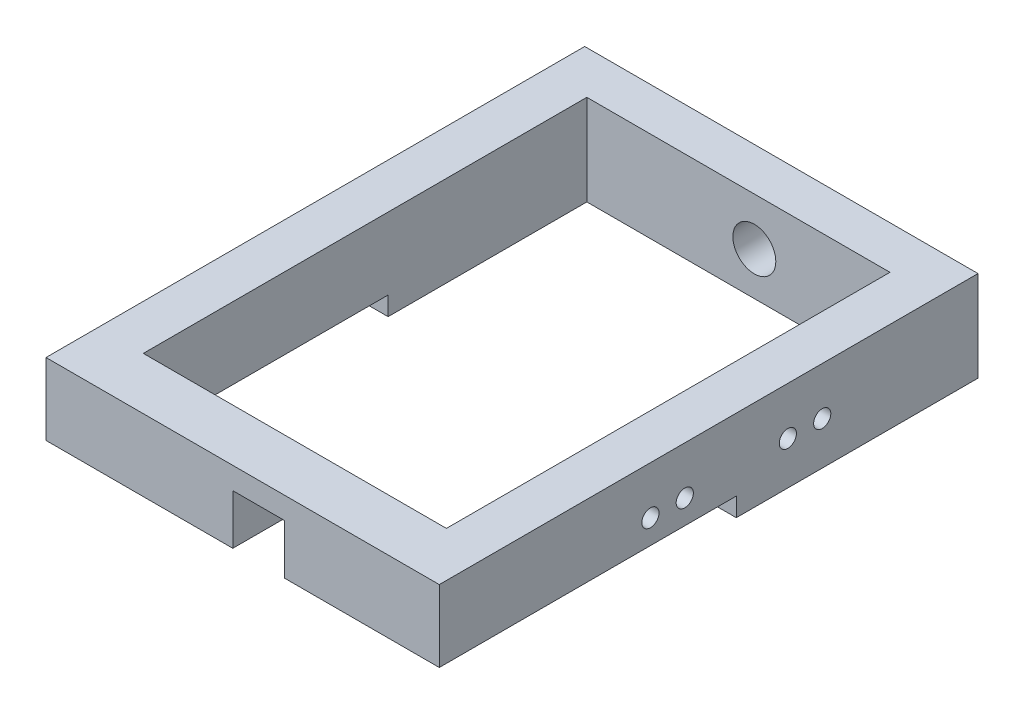
ISO-10303-21;
HEADER;
FILE_DESCRIPTION(('STEP AP214'),'2;1');
FILE_NAME('part.step','',(''),(''),'','','');
FILE_SCHEMA(('AUTOMOTIVE_DESIGN { 1 0 10303 214 1 1 1 1 }'));
ENDSEC;
DATA;
#1=APPLICATION_CONTEXT('core data for automotive mechanical design processes');
#2=APPLICATION_PROTOCOL_DEFINITION('international standard','automotive_design',2000,#1);
#3=PRODUCT_CONTEXT('',#1,'mechanical');
#4=PRODUCT('Part','Part','',(#3));
#5=PRODUCT_RELATED_PRODUCT_CATEGORY('part','',(#4));
#6=PRODUCT_DEFINITION_FORMATION('','',#4);
#7=PRODUCT_DEFINITION_CONTEXT('part definition',#1,'design');
#8=PRODUCT_DEFINITION('design','',#6,#7);
#9=PRODUCT_DEFINITION_SHAPE('','',#8);
#10=(LENGTH_UNIT() NAMED_UNIT(*) SI_UNIT(.MILLI.,.METRE.));
#11=(NAMED_UNIT(*) PLANE_ANGLE_UNIT() SI_UNIT($,.RADIAN.));
#12=(NAMED_UNIT(*) SI_UNIT($,.STERADIAN.) SOLID_ANGLE_UNIT());
#13=UNCERTAINTY_MEASURE_WITH_UNIT(LENGTH_MEASURE(1.E-05),#10,'distance_accuracy_value','');
#14=(GEOMETRIC_REPRESENTATION_CONTEXT(3) GLOBAL_UNCERTAINTY_ASSIGNED_CONTEXT((#13)) GLOBAL_UNIT_ASSIGNED_CONTEXT((#10,
#11,#12)) REPRESENTATION_CONTEXT('',''));
#15=CARTESIAN_POINT('',(0.,0.,0.));
#16=DIRECTION('',(0.,0.,1.));
#17=DIRECTION('',(1.,0.,0.));
#18=AXIS2_PLACEMENT_3D('',#15,#16,#17);
#19=CARTESIAN_POINT('',(-49.4934002594435,-10.,-56.2701665379258));
#20=DIRECTION('',(-1.,0.,0.));
#21=DIRECTION('',(0.,0.,1.));
#22=AXIS2_PLACEMENT_3D('',#19,#20,#21);
#23=PLANE('',#22);
#24=CARTESIAN_POINT('',(-49.4934002594435,0.,0.));
#25=DIRECTION('',(-1.,0.,0.));
#26=DIRECTION('',(0.,0.,1.));
#27=AXIS2_PLACEMENT_3D('',#24,#25,#26);
#28=CIRCLE('',#27,1.6);
#29=CARTESIAN_POINT('',(-49.4934002594435,0.,1.59999999999997));
#30=VERTEX_POINT('',#29);
#31=EDGE_CURVE('E11',#30,#30,#28,.T.);
#32=ORIENTED_EDGE('',*,*,#31,.F.);
#33=EDGE_LOOP('',(#32));
#34=FACE_BOUND('',#33,.T.);
#35=DIRECTION('',(0.,1.,0.));
#36=VECTOR('',#35,1.);
#37=CARTESIAN_POINT('',(-49.4934002594435,9.99999999999999,-56.2701665379258));
#38=LINE('',#37,#36);
#39=CARTESIAN_POINT('',(-49.4934002594435,-10.,-56.2701665379258));
#40=VERTEX_POINT('',#39);
#41=CARTESIAN_POINT('',(-49.4934002594435,11.1,-56.2701665379258));
#42=VERTEX_POINT('',#41);
#43=EDGE_CURVE('E234',#40,#42,#38,.T.);
#44=ORIENTED_EDGE('',*,*,#43,.F.);
#45=DIRECTION('',(0.,0.,-1.));
#46=VECTOR('',#45,1.);
#47=CARTESIAN_POINT('',(-49.4934002594435,-10.,-56.2701665379258));
#48=LINE('',#47,#46);
#49=CARTESIAN_POINT('',(-49.4934002594435,-10.,0.));
#50=VERTEX_POINT('',#49);
#51=EDGE_CURVE('E167',#50,#40,#48,.T.);
#52=ORIENTED_EDGE('',*,*,#51,.F.);
#53=DIRECTION('',(0.,-1.,0.));
#54=VECTOR('',#53,1.);
#55=CARTESIAN_POINT('',(-49.4934002594435,-10.,0.));
#56=LINE('',#55,#54);
#57=CARTESIAN_POINT('',(-49.4934002594435,-5.62653437580412,0.));
#58=VERTEX_POINT('',#57);
#59=EDGE_CURVE('E313',#58,#50,#56,.T.);
#60=ORIENTED_EDGE('',*,*,#59,.F.);
#61=DIRECTION('',(0.,0.,-1.));
#62=VECTOR('',#61,1.);
#63=CARTESIAN_POINT('',(-49.4934002594435,-5.62653437580412,0.));
#64=LINE('',#63,#62);
#65=CARTESIAN_POINT('',(-49.4934002594435,-5.62653437580411,69.1504462980529));
#66=VERTEX_POINT('',#65);
#67=EDGE_CURVE('E311',#66,#58,#64,.T.);
#68=ORIENTED_EDGE('',*,*,#67,.F.);
#69=DIRECTION('',(0.,1.,0.));
#70=VECTOR('',#69,1.);
#71=CARTESIAN_POINT('',(-49.4934002594435,0.,69.1504462980529));
#72=LINE('',#71,#70);
#73=CARTESIAN_POINT('',(-49.4934002594435,11.1,69.1504462980529));
#74=VERTEX_POINT('',#73);
#75=EDGE_CURVE('E272',#66,#74,#72,.T.);
#76=ORIENTED_EDGE('',*,*,#75,.T.);
#77=DIRECTION('',(0.,0.,1.));
#78=VECTOR('',#77,1.);
#79=CARTESIAN_POINT('',(-49.4934002594435,11.1,-56.2701665379259));
#80=LINE('',#79,#78);
#81=EDGE_CURVE('E237',#42,#74,#80,.T.);
#82=ORIENTED_EDGE('',*,*,#81,.F.);
#83=EDGE_LOOP('',(#44,#52,#60,#68,#76,#82));
#84=FACE_BOUND('',#83,.T.);
#85=ADVANCED_FACE('F39',(#34,#84),#23,.T.);
#86=CARTESIAN_POINT('',(-43.4934002594435,0.,0.));
#87=DIRECTION('',(-1.,0.,0.));
#88=DIRECTION('',(0.,0.,1.));
#89=AXIS2_PLACEMENT_3D('',#86,#87,#88);
#90=PLANE('',#89);
#91=CARTESIAN_POINT('',(-43.4934002594435,0.,0.));
#92=DIRECTION('',(-1.,0.,0.));
#93=DIRECTION('',(0.,0.,1.));
#94=AXIS2_PLACEMENT_3D('',#91,#92,#93);
#95=CIRCLE('',#94,1.6);
#96=CARTESIAN_POINT('',(-43.4934002594435,0.,1.59999999999997));
#97=VERTEX_POINT('',#96);
#98=EDGE_CURVE('E46',#97,#97,#95,.T.);
#99=ORIENTED_EDGE('',*,*,#98,.T.);
#100=EDGE_LOOP('',(#99));
#101=FACE_BOUND('',#100,.T.);
#102=ADVANCED_FACE('F221',(#101),#90,.T.);
#103=CARTESIAN_POINT('',(-43.4934002594435,0.,0.));
#104=DIRECTION('',(-1.,0.,0.));
#105=DIRECTION('',(0.,0.,1.));
#106=AXIS2_PLACEMENT_3D('',#103,#104,#105);
#107=CYLINDRICAL_SURFACE('',#106,1.6);
#108=ORIENTED_EDGE('',*,*,#98,.F.);
#109=EDGE_LOOP('',(#108));
#110=FACE_BOUND('',#109,.T.);
#111=ORIENTED_EDGE('',*,*,#31,.T.);
#112=EDGE_LOOP('',(#111));
#113=FACE_BOUND('',#112,.T.);
#114=ADVANCED_FACE('F223',(#110,#113),#107,.F.);
#115=CARTESIAN_POINT('',(39.0046939080692,-153.627991700782,-46.2701665379259));
#116=DIRECTION('',(0.,0.,-1.));
#117=DIRECTION('',(-1.,0.,0.));
#118=AXIS2_PLACEMENT_3D('',#115,#116,#117);
#119=PLANE('',#118);
#120=CARTESIAN_POINT('',(0.,0.,-46.2701665379258));
#121=DIRECTION('',(0.,0.,-1.));
#122=DIRECTION('',(-1.,0.,0.));
#123=AXIS2_PLACEMENT_3D('',#120,#121,#122);
#124=CIRCLE('',#123,5.);
#125=CARTESIAN_POINT('',(-5.,0.,-46.2701665379258));
#126=VERTEX_POINT('',#125);
#127=EDGE_CURVE('E241',#126,#126,#124,.T.);
#128=ORIENTED_EDGE('',*,*,#127,.T.);
#129=EDGE_LOOP('',(#128));
#130=FACE_BOUND('',#129,.T.);
#131=DIRECTION('',(0.,1.,0.));
#132=VECTOR('',#131,1.);
#133=CARTESIAN_POINT('',(-38.9953060919308,-153.627991700782,-46.2701665379258));
#134=LINE('',#133,#132);
#135=CARTESIAN_POINT('',(-38.9953060919308,-10.,-46.2701665379258));
#136=VERTEX_POINT('',#135);
#137=CARTESIAN_POINT('',(-38.9953060919308,11.1000000000001,-46.2701665379258));
#138=VERTEX_POINT('',#137);
#139=EDGE_CURVE('E249',#136,#138,#134,.T.);
#140=ORIENTED_EDGE('',*,*,#139,.F.);
#141=DIRECTION('',(-1.,0.,0.));
#142=VECTOR('',#141,1.);
#143=CARTESIAN_POINT('',(57.7024821024995,-10.,-46.2701665379258));
#144=LINE('',#143,#142);
#145=CARTESIAN_POINT('',(31.5737259682035,-10.,-46.2701665379258));
#146=VERTEX_POINT('',#145);
#147=EDGE_CURVE('E53',#146,#136,#144,.T.);
#148=ORIENTED_EDGE('',*,*,#147,.F.);
#149=DIRECTION('',(0.,-1.,0.));
#150=VECTOR('',#149,1.);
#151=CARTESIAN_POINT('',(31.5737259682035,116.946619499942,-46.2701665379259));
#152=LINE('',#151,#150);
#153=CARTESIAN_POINT('',(31.5737259682035,11.1,-46.2701665379258));
#154=VERTEX_POINT('',#153);
#155=EDGE_CURVE('E320',#154,#146,#152,.T.);
#156=ORIENTED_EDGE('',*,*,#155,.F.);
#157=DIRECTION('',(-1.,0.,0.));
#158=VECTOR('',#157,1.);
#159=CARTESIAN_POINT('',(-38.9953060919308,11.1,-46.2701665379258));
#160=LINE('',#159,#158);
#161=EDGE_CURVE('E243',#154,#138,#160,.T.);
#162=ORIENTED_EDGE('',*,*,#161,.T.);
#163=EDGE_LOOP('',(#140,#148,#156,#162));
#164=FACE_BOUND('',#163,.T.);
#165=ADVANCED_FACE('F226',(#130,#164),#119,.F.);
#166=CARTESIAN_POINT('',(-19.0908587733399,-10.,49.4934002594435));
#167=DIRECTION('',(0.,-1.,0.));
#168=DIRECTION('',(0.,0.,-1.));
#169=AXIS2_PLACEMENT_3D('',#166,#167,#168);
#170=PLANE('',#169);
#171=DIRECTION('',(1.,0.,0.));
#172=VECTOR('',#171,1.);
#173=CARTESIAN_POINT('',(-26.9589878721262,-10.,0.));
#174=LINE('',#173,#172);
#175=CARTESIAN_POINT('',(31.5737259682035,-10.,0.));
#176=VERTEX_POINT('',#175);
#177=CARTESIAN_POINT('',(42.0737259682035,-10.,0.));
#178=VERTEX_POINT('',#177);
#179=EDGE_CURVE('E184',#176,#178,#174,.T.);
#180=ORIENTED_EDGE('',*,*,#179,.F.);
#181=DIRECTION('',(0.,0.,-1.));
#182=VECTOR('',#181,1.);
#183=CARTESIAN_POINT('',(31.5737259682035,-10.,-46.2701665379259));
#184=LINE('',#183,#182);
#185=EDGE_CURVE('E160',#176,#146,#184,.T.);
#186=ORIENTED_EDGE('',*,*,#185,.T.);
#187=ORIENTED_EDGE('',*,*,#147,.T.);
#188=DIRECTION('',(0.,0.,-1.));
#189=VECTOR('',#188,1.);
#190=CARTESIAN_POINT('',(-38.9953060919308,-10.,38.7298334620742));
#191=LINE('',#190,#189);
#192=CARTESIAN_POINT('',(-38.9953060919308,-10.,0.));
#193=VERTEX_POINT('',#192);
#194=EDGE_CURVE('E250',#193,#136,#191,.T.);
#195=ORIENTED_EDGE('',*,*,#194,.F.);
#196=DIRECTION('',(-1.,0.,0.));
#197=VECTOR('',#196,1.);
#198=CARTESIAN_POINT('',(127.303839891806,-10.,0.));
#199=LINE('',#198,#197);
#200=EDGE_CURVE('E306',#193,#50,#199,.T.);
#201=ORIENTED_EDGE('',*,*,#200,.T.);
#202=ORIENTED_EDGE('',*,*,#51,.T.);
#203=DIRECTION('',(1.,0.,0.));
#204=VECTOR('',#203,1.);
#205=CARTESIAN_POINT('',(-48.9953060919308,-10.,-56.2701665379258));
#206=LINE('',#205,#204);
#207=CARTESIAN_POINT('',(42.0737259682035,-10.,-56.2701665379258));
#208=VERTEX_POINT('',#207);
#209=EDGE_CURVE('E163',#40,#208,#206,.T.);
#210=ORIENTED_EDGE('',*,*,#209,.T.);
#211=DIRECTION('',(0.,0.,-1.));
#212=VECTOR('',#211,1.);
#213=CARTESIAN_POINT('',(42.0737259682035,-10.,49.4934002594435));
#214=LINE('',#213,#212);
#215=EDGE_CURVE('E150',#178,#208,#214,.T.);
#216=ORIENTED_EDGE('',*,*,#215,.F.);
#217=EDGE_LOOP('',(#180,#186,#187,#195,#201,#202,#210,#216));
#218=FACE_BOUND('',#217,.T.);
#219=ADVANCED_FACE('F164',(#218),#170,.T.);
#220=CARTESIAN_POINT('',(6.0008587733397,0.,0.));
#221=DIRECTION('',(-1.,0.,0.));
#222=DIRECTION('',(0.,0.,1.));
#223=AXIS2_PLACEMENT_3D('',#220,#221,#222);
#224=PLANE('',#223);
#225=DIRECTION('',(0.,0.,-1.));
#226=VECTOR('',#225,1.);
#227=CARTESIAN_POINT('',(6.0008587733397,-5.62653437580412,0.));
#228=LINE('',#227,#226);
#229=CARTESIAN_POINT('',(6.0008587733397,-5.62653437580411,69.1504462980529));
#230=VERTEX_POINT('',#229);
#231=CARTESIAN_POINT('',(6.0008587733397,-5.62653437580411,56.9948877458678));
#232=VERTEX_POINT('',#231);
#233=EDGE_CURVE('E301',#230,#232,#228,.T.);
#234=ORIENTED_EDGE('',*,*,#233,.F.);
#235=DIRECTION('',(0.,-1.,0.));
#236=VECTOR('',#235,1.);
#237=CARTESIAN_POINT('',(6.0008587733397,0.,69.1504462980529));
#238=LINE('',#237,#236);
#239=CARTESIAN_POINT('',(6.0008587733397,5.99999999999999,69.1504462980529));
#240=VERTEX_POINT('',#239);
#241=EDGE_CURVE('E282',#240,#230,#238,.T.);
#242=ORIENTED_EDGE('',*,*,#241,.F.);
#243=DIRECTION('',(0.,0.,-1.));
#244=VECTOR('',#243,1.);
#245=CARTESIAN_POINT('',(6.0008587733397,5.99999999999999,56.9948877458678));
#246=LINE('',#245,#244);
#247=CARTESIAN_POINT('',(6.0008587733397,5.99999999999999,56.9948877458678));
#248=VERTEX_POINT('',#247);
#249=EDGE_CURVE('E265',#240,#248,#246,.T.);
#250=ORIENTED_EDGE('',*,*,#249,.T.);
#251=DIRECTION('',(0.,1.,0.));
#252=VECTOR('',#251,1.);
#253=CARTESIAN_POINT('',(6.0008587733397,0.,56.9948877458678));
#254=LINE('',#253,#252);
#255=EDGE_CURVE('E252',#232,#248,#254,.T.);
#256=ORIENTED_EDGE('',*,*,#255,.F.);
#257=EDGE_LOOP('',(#234,#242,#250,#256));
#258=FACE_BOUND('',#257,.T.);
#259=ADVANCED_FACE('F368',(#258),#224,.T.);
#260=CARTESIAN_POINT('',(0.,11.1,0.));
#261=DIRECTION('',(0.,1.,0.));
#262=DIRECTION('',(0.,0.,1.));
#263=AXIS2_PLACEMENT_3D('',#260,#261,#262);
#264=PLANE('',#263);
#265=DIRECTION('',(0.,0.,-1.));
#266=VECTOR('',#265,1.);
#267=CARTESIAN_POINT('',(42.0737259682035,11.1,-56.2701665379259));
#268=LINE('',#267,#266);
#269=CARTESIAN_POINT('',(42.0737259682035,11.1,69.1504462980529));
#270=VERTEX_POINT('',#269);
#271=CARTESIAN_POINT('',(42.0737259682035,11.1,-56.2701665379258));
#272=VERTEX_POINT('',#271);
#273=EDGE_CURVE('E176',#270,#272,#268,.T.);
#274=ORIENTED_EDGE('',*,*,#273,.T.);
#275=DIRECTION('',(-1.,0.,0.));
#276=VECTOR('',#275,1.);
#277=CARTESIAN_POINT('',(-49.4934002594435,11.1,-56.2701665379258));
#278=LINE('',#277,#276);
#279=EDGE_CURVE('E175',#272,#42,#278,.T.);
#280=ORIENTED_EDGE('',*,*,#279,.T.);
#281=ORIENTED_EDGE('',*,*,#81,.T.);
#282=DIRECTION('',(1.,0.,0.));
#283=VECTOR('',#282,1.);
#284=CARTESIAN_POINT('',(-54.9953060919308,11.1,69.1504462980529));
#285=LINE('',#284,#283);
#286=EDGE_CURVE('E289',#74,#270,#285,.T.);
#287=ORIENTED_EDGE('',*,*,#286,.T.);
#288=EDGE_LOOP('',(#274,#280,#281,#287));
#289=FACE_BOUND('',#288,.T.);
#290=ORIENTED_EDGE('',*,*,#161,.F.);
#291=DIRECTION('',(0.,0.,-1.));
#292=VECTOR('',#291,1.);
#293=CARTESIAN_POINT('',(31.5737259682035,11.1,-46.2701665379259));
#294=LINE('',#293,#292);
#295=CARTESIAN_POINT('',(31.5737259682035,11.1,56.9948877458678));
#296=VERTEX_POINT('',#295);
#297=EDGE_CURVE('E323',#296,#154,#294,.T.);
#298=ORIENTED_EDGE('',*,*,#297,.F.);
#299=DIRECTION('',(1.,0.,0.));
#300=VECTOR('',#299,1.);
#301=CARTESIAN_POINT('',(38.9953060919308,11.1,56.9948877458678));
#302=LINE('',#301,#300);
#303=CARTESIAN_POINT('',(-38.9953060919308,11.1,56.9948877458678));
#304=VERTEX_POINT('',#303);
#305=EDGE_CURVE('E258',#304,#296,#302,.T.);
#306=ORIENTED_EDGE('',*,*,#305,.F.);
#307=DIRECTION('',(0.,0.,1.));
#308=VECTOR('',#307,1.);
#309=CARTESIAN_POINT('',(-38.9953060919308,11.1,-46.2701665379259));
#310=LINE('',#309,#308);
#311=EDGE_CURVE('E337',#138,#304,#310,.T.);
#312=ORIENTED_EDGE('',*,*,#311,.F.);
#313=EDGE_LOOP('',(#290,#298,#306,#312));
#314=FACE_BOUND('',#313,.T.);
#315=ADVANCED_FACE('F334',(#289,#314),#264,.T.);
#316=CARTESIAN_POINT('',(-48.9953060919308,-153.627991700782,-56.2701665379258));
#317=DIRECTION('',(0.,0.,-1.));
#318=DIRECTION('',(-1.,0.,0.));
#319=AXIS2_PLACEMENT_3D('',#316,#317,#318);
#320=PLANE('',#319);
#321=ORIENTED_EDGE('',*,*,#209,.F.);
#322=ORIENTED_EDGE('',*,*,#43,.T.);
#323=ORIENTED_EDGE('',*,*,#279,.F.);
#324=DIRECTION('',(0.,-1.,0.));
#325=VECTOR('',#324,1.);
#326=CARTESIAN_POINT('',(42.0737259682035,137.529670897381,-56.2701665379258));
#327=LINE('',#326,#325);
#328=EDGE_CURVE('E154',#272,#208,#327,.T.);
#329=ORIENTED_EDGE('',*,*,#328,.T.);
#330=EDGE_LOOP('',(#321,#322,#323,#329));
#331=FACE_BOUND('',#330,.T.);
#332=ADVANCED_FACE('F173',(#331),#320,.T.);
#333=CARTESIAN_POINT('',(-38.9953060919308,-153.627991700782,38.7298334620742));
#334=DIRECTION('',(-1.,0.,0.));
#335=DIRECTION('',(0.,0.,1.));
#336=AXIS2_PLACEMENT_3D('',#333,#334,#335);
#337=PLANE('',#336);
#338=DIRECTION('',(0.,1.,0.));
#339=VECTOR('',#338,1.);
#340=CARTESIAN_POINT('',(-38.9953060919308,-88.0016111899646,56.9948877458677));
#341=LINE('',#340,#339);
#342=CARTESIAN_POINT('',(-38.9953060919308,-5.62653437580411,56.9948877458678));
#343=VERTEX_POINT('',#342);
#344=EDGE_CURVE('E256',#343,#304,#341,.T.);
#345=ORIENTED_EDGE('',*,*,#344,.F.);
#346=DIRECTION('',(0.,0.,-1.));
#347=VECTOR('',#346,1.);
#348=CARTESIAN_POINT('',(-38.9953060919308,-5.62653437580413,38.7298334620741));
#349=LINE('',#348,#347);
#350=CARTESIAN_POINT('',(-38.9953060919308,-5.62653437580412,0.));
#351=VERTEX_POINT('',#350);
#352=EDGE_CURVE('E295',#343,#351,#349,.T.);
#353=ORIENTED_EDGE('',*,*,#352,.T.);
#354=DIRECTION('',(0.,-1.,0.));
#355=VECTOR('',#354,1.);
#356=CARTESIAN_POINT('',(-38.9953060919308,-153.627991700782,0.));
#357=LINE('',#356,#355);
#358=EDGE_CURVE('E292',#351,#193,#357,.T.);
#359=ORIENTED_EDGE('',*,*,#358,.T.);
#360=ORIENTED_EDGE('',*,*,#194,.T.);
#361=ORIENTED_EDGE('',*,*,#139,.T.);
#362=ORIENTED_EDGE('',*,*,#311,.T.);
#363=EDGE_LOOP('',(#345,#353,#359,#360,#361,#362));
#364=FACE_BOUND('',#363,.T.);
#365=ADVANCED_FACE('F381',(#364),#337,.F.);
#366=CARTESIAN_POINT('',(0.,0.,-53.5));
#367=DIRECTION('',(0.,0.,1.));
#368=DIRECTION('',(1.,0.,0.));
#369=AXIS2_PLACEMENT_3D('',#366,#367,#368);
#370=CYLINDRICAL_SURFACE('',#369,5.);
#371=CARTESIAN_POINT('',(0.,0.,-53.5));
#372=DIRECTION('',(0.,0.,1.));
#373=DIRECTION('',(1.,0.,0.));
#374=AXIS2_PLACEMENT_3D('',#371,#372,#373);
#375=CIRCLE('',#374,5.);
#376=CARTESIAN_POINT('',(5.,0.,-53.5));
#377=VERTEX_POINT('',#376);
#378=EDGE_CURVE('E238',#377,#377,#375,.T.);
#379=ORIENTED_EDGE('',*,*,#378,.F.);
#380=EDGE_LOOP('',(#379));
#381=FACE_BOUND('',#380,.T.);
#382=ORIENTED_EDGE('',*,*,#127,.F.);
#383=EDGE_LOOP('',(#382));
#384=FACE_BOUND('',#383,.T.);
#385=ADVANCED_FACE('F464',(#381,#384),#370,.F.);
#386=CARTESIAN_POINT('',(0.,0.,-53.5));
#387=DIRECTION('',(0.,0.,1.));
#388=DIRECTION('',(1.,0.,0.));
#389=AXIS2_PLACEMENT_3D('',#386,#387,#388);
#390=PLANE('',#389);
#391=ORIENTED_EDGE('',*,*,#378,.T.);
#392=EDGE_LOOP('',(#391));
#393=FACE_BOUND('',#392,.T.);
#394=ADVANCED_FACE('F460',(#393),#390,.T.);
#395=CARTESIAN_POINT('',(-5.99990661614473,-58.2622521825962,48.6850177458678));
#396=DIRECTION('',(1.,0.,0.));
#397=DIRECTION('',(0.,0.,-1.));
#398=AXIS2_PLACEMENT_3D('',#395,#396,#397);
#399=PLANE('',#398);
#400=DIRECTION('',(0.,0.,1.));
#401=VECTOR('',#400,1.);
#402=CARTESIAN_POINT('',(-5.99990661614473,-5.62653437580412,48.6850177458678));
#403=LINE('',#402,#401);
#404=CARTESIAN_POINT('',(-5.99990661614473,-5.62653437580411,56.9948877458678));
#405=VERTEX_POINT('',#404);
#406=CARTESIAN_POINT('',(-5.99990661614473,-5.62653437580411,69.1504462980529));
#407=VERTEX_POINT('',#406);
#408=EDGE_CURVE('E298',#405,#407,#403,.T.);
#409=ORIENTED_EDGE('',*,*,#408,.F.);
#410=DIRECTION('',(0.,-1.,0.));
#411=VECTOR('',#410,1.);
#412=CARTESIAN_POINT('',(-5.99990661614473,-58.2622521825962,56.9948877458677));
#413=LINE('',#412,#411);
#414=CARTESIAN_POINT('',(-5.99990661614473,6.,56.9948877458678));
#415=VERTEX_POINT('',#414);
#416=EDGE_CURVE('E342',#415,#405,#413,.T.);
#417=ORIENTED_EDGE('',*,*,#416,.F.);
#418=DIRECTION('',(0.,0.,1.));
#419=VECTOR('',#418,1.);
#420=CARTESIAN_POINT('',(-5.99990661614473,5.99999999999999,56.9948877458678));
#421=LINE('',#420,#419);
#422=CARTESIAN_POINT('',(-5.99990661614473,5.99999999999999,69.1504462980529));
#423=VERTEX_POINT('',#422);
#424=EDGE_CURVE('E260',#415,#423,#421,.T.);
#425=ORIENTED_EDGE('',*,*,#424,.T.);
#426=DIRECTION('',(0.,1.,0.));
#427=VECTOR('',#426,1.);
#428=CARTESIAN_POINT('',(-5.99990661614473,-58.2622521825962,69.1504462980529));
#429=LINE('',#428,#427);
#430=EDGE_CURVE('E285',#407,#423,#429,.T.);
#431=ORIENTED_EDGE('',*,*,#430,.F.);
#432=EDGE_LOOP('',(#409,#417,#425,#431));
#433=FACE_BOUND('',#432,.T.);
#434=ADVANCED_FACE('F358',(#433),#399,.T.);
#435=CARTESIAN_POINT('',(38.9953060919308,-88.0016111899646,56.9948877458677));
#436=DIRECTION('',(0.,0.,1.));
#437=DIRECTION('',(0.,-1.,0.));
#438=AXIS2_PLACEMENT_3D('',#435,#436,#437);
#439=PLANE('',#438);
#440=CARTESIAN_POINT('',(-3.50000000000004,8.50000000000009,56.9948877458678));
#441=DIRECTION('',(0.,0.,-1.));
#442=DIRECTION('',(0.,1.,0.));
#443=AXIS2_PLACEMENT_3D('',#440,#441,#442);
#444=CIRCLE('',#443,1.6);
#445=CARTESIAN_POINT('',(-3.50000000000004,10.1000000000001,56.9948877458678));
#446=VERTEX_POINT('',#445);
#447=EDGE_CURVE('E276',#446,#446,#444,.T.);
#448=ORIENTED_EDGE('',*,*,#447,.F.);
#449=EDGE_LOOP('',(#448));
#450=FACE_BOUND('',#449,.T.);
#451=CARTESIAN_POINT('',(3.49999999999996,8.50000000000009,56.9948877458678));
#452=DIRECTION('',(0.,0.,-1.));
#453=DIRECTION('',(0.,1.,0.));
#454=AXIS2_PLACEMENT_3D('',#451,#452,#453);
#455=CIRCLE('',#454,1.6);
#456=CARTESIAN_POINT('',(3.49999999999996,10.1000000000001,56.9948877458678));
#457=VERTEX_POINT('',#456);
#458=EDGE_CURVE('E273',#457,#457,#455,.T.);
#459=ORIENTED_EDGE('',*,*,#458,.F.);
#460=EDGE_LOOP('',(#459));
#461=FACE_BOUND('',#460,.T.);
#462=ORIENTED_EDGE('',*,*,#305,.T.);
#463=DIRECTION('',(0.,-1.,0.));
#464=VECTOR('',#463,1.);
#465=CARTESIAN_POINT('',(31.5737259682035,-88.0016111899646,56.9948877458677));
#466=LINE('',#465,#464);
#467=CARTESIAN_POINT('',(31.5737259682035,-5.62653437580411,56.9948877458678));
#468=VERTEX_POINT('',#467);
#469=EDGE_CURVE('E315',#296,#468,#466,.T.);
#470=ORIENTED_EDGE('',*,*,#469,.T.);
#471=DIRECTION('',(-1.,0.,0.));
#472=VECTOR('',#471,1.);
#473=CARTESIAN_POINT('',(38.9953060919308,-5.62653437580411,56.9948877458678));
#474=LINE('',#473,#472);
#475=EDGE_CURVE('E304',#468,#232,#474,.T.);
#476=ORIENTED_EDGE('',*,*,#475,.T.);
#477=ORIENTED_EDGE('',*,*,#255,.T.);
#478=DIRECTION('',(-1.,0.,0.));
#479=VECTOR('',#478,1.);
#480=CARTESIAN_POINT('',(6.0008587733397,5.99999999999999,56.9948877458678));
#481=LINE('',#480,#479);
#482=EDGE_CURVE('E263',#248,#415,#481,.T.);
#483=ORIENTED_EDGE('',*,*,#482,.T.);
#484=ORIENTED_EDGE('',*,*,#416,.T.);
#485=EDGE_CURVE('E300',#405,#343,#474,.T.);
#486=ORIENTED_EDGE('',*,*,#485,.T.);
#487=ORIENTED_EDGE('',*,*,#344,.T.);
#488=EDGE_LOOP('',(#462,#470,#476,#477,#483,#484,#486,#487));
#489=FACE_BOUND('',#488,.T.);
#490=ADVANCED_FACE('F455',(#450,#461,#489),#439,.F.);
#491=CARTESIAN_POINT('',(0.,6.,0.));
#492=DIRECTION('',(0.,-1.,0.));
#493=DIRECTION('',(0.,0.,-1.));
#494=AXIS2_PLACEMENT_3D('',#491,#492,#493);
#495=PLANE('',#494);
#496=DIRECTION('',(1.,0.,0.));
#497=VECTOR('',#496,1.);
#498=CARTESIAN_POINT('',(0.,5.99999999999999,69.1504462980529));
#499=LINE('',#498,#497);
#500=EDGE_CURVE('E287',#423,#240,#499,.T.);
#501=ORIENTED_EDGE('',*,*,#500,.F.);
#502=ORIENTED_EDGE('',*,*,#424,.F.);
#503=ORIENTED_EDGE('',*,*,#482,.F.);
#504=ORIENTED_EDGE('',*,*,#249,.F.);
#505=EDGE_LOOP('',(#501,#502,#503,#504));
#506=FACE_BOUND('',#505,.T.);
#507=ADVANCED_FACE('F363',(#506),#495,.T.);
#508=CARTESIAN_POINT('',(3.49999999999997,8.50000000000009,62.9948877458678));
#509=DIRECTION('',(0.,0.,-1.));
#510=DIRECTION('',(0.,1.,0.));
#511=AXIS2_PLACEMENT_3D('',#508,#509,#510);
#512=CYLINDRICAL_SURFACE('',#511,1.6);
#513=CARTESIAN_POINT('',(3.49999999999997,8.50000000000009,62.9948877458678));
#514=DIRECTION('',(0.,0.,-1.));
#515=DIRECTION('',(0.,1.,0.));
#516=AXIS2_PLACEMENT_3D('',#513,#514,#515);
#517=CIRCLE('',#516,1.6);
#518=CARTESIAN_POINT('',(3.49999999999997,10.1000000000001,62.9948877458678));
#519=VERTEX_POINT('',#518);
#520=EDGE_CURVE('E269',#519,#519,#517,.T.);
#521=ORIENTED_EDGE('',*,*,#520,.F.);
#522=EDGE_LOOP('',(#521));
#523=FACE_BOUND('',#522,.T.);
#524=ORIENTED_EDGE('',*,*,#458,.T.);
#525=EDGE_LOOP('',(#524));
#526=FACE_BOUND('',#525,.T.);
#527=ADVANCED_FACE('F446',(#523,#526),#512,.F.);
#528=CARTESIAN_POINT('',(3.49999999999997,8.50000000000009,62.9948877458678));
#529=DIRECTION('',(0.,0.,-1.));
#530=DIRECTION('',(0.,1.,0.));
#531=AXIS2_PLACEMENT_3D('',#528,#529,#530);
#532=PLANE('',#531);
#533=ORIENTED_EDGE('',*,*,#520,.T.);
#534=EDGE_LOOP('',(#533));
#535=FACE_BOUND('',#534,.T.);
#536=ADVANCED_FACE('F444',(#535),#532,.T.);
#537=CARTESIAN_POINT('',(-3.50000000000003,8.50000000000009,62.9948877458678));
#538=DIRECTION('',(0.,0.,-1.));
#539=DIRECTION('',(0.,1.,0.));
#540=AXIS2_PLACEMENT_3D('',#537,#538,#539);
#541=CYLINDRICAL_SURFACE('',#540,1.6);
#542=CARTESIAN_POINT('',(-3.50000000000003,8.50000000000009,62.9948877458678));
#543=DIRECTION('',(0.,0.,-1.));
#544=DIRECTION('',(0.,1.,0.));
#545=AXIS2_PLACEMENT_3D('',#542,#543,#544);
#546=CIRCLE('',#545,1.6);
#547=CARTESIAN_POINT('',(-3.50000000000003,10.1000000000001,62.9948877458678));
#548=VERTEX_POINT('',#547);
#549=EDGE_CURVE('E268',#548,#548,#546,.T.);
#550=ORIENTED_EDGE('',*,*,#549,.F.);
#551=EDGE_LOOP('',(#550));
#552=FACE_BOUND('',#551,.T.);
#553=ORIENTED_EDGE('',*,*,#447,.T.);
#554=EDGE_LOOP('',(#553));
#555=FACE_BOUND('',#554,.T.);
#556=ADVANCED_FACE('F440',(#552,#555),#541,.F.);
#557=CARTESIAN_POINT('',(-3.50000000000003,8.50000000000009,62.9948877458678));
#558=DIRECTION('',(0.,0.,-1.));
#559=DIRECTION('',(0.,1.,0.));
#560=AXIS2_PLACEMENT_3D('',#557,#558,#559);
#561=PLANE('',#560);
#562=ORIENTED_EDGE('',*,*,#549,.T.);
#563=EDGE_LOOP('',(#562));
#564=FACE_BOUND('',#563,.T.);
#565=ADVANCED_FACE('F437',(#564),#561,.T.);
#566=CARTESIAN_POINT('',(-54.9953060919308,11.1,69.1504462980529));
#567=DIRECTION('',(0.,0.,-1.));
#568=DIRECTION('',(-1.,0.,0.));
#569=AXIS2_PLACEMENT_3D('',#566,#567,#568);
#570=PLANE('',#569);
#571=DIRECTION('',(-1.,0.,0.));
#572=VECTOR('',#571,1.);
#573=CARTESIAN_POINT('',(127.303839891806,-5.62653437580411,69.1504462980529));
#574=LINE('',#573,#572);
#575=CARTESIAN_POINT('',(42.0737259682035,-5.62653437580413,69.1504462980529));
#576=VERTEX_POINT('',#575);
#577=EDGE_CURVE('E309',#576,#230,#574,.T.);
#578=ORIENTED_EDGE('',*,*,#577,.F.);
#579=DIRECTION('',(0.,-1.,0.));
#580=VECTOR('',#579,1.);
#581=CARTESIAN_POINT('',(42.0737259682035,137.529670897381,69.1504462980529));
#582=LINE('',#581,#580);
#583=EDGE_CURVE('E178',#270,#576,#582,.T.);
#584=ORIENTED_EDGE('',*,*,#583,.F.);
#585=ORIENTED_EDGE('',*,*,#286,.F.);
#586=ORIENTED_EDGE('',*,*,#75,.F.);
#587=DIRECTION('',(1.,0.,0.));
#588=VECTOR('',#587,1.);
#589=CARTESIAN_POINT('',(-54.9953060919308,-5.62653437580411,69.1504462980529));
#590=LINE('',#589,#588);
#591=EDGE_CURVE('E345',#66,#407,#590,.T.);
#592=ORIENTED_EDGE('',*,*,#591,.T.);
#593=ORIENTED_EDGE('',*,*,#430,.T.);
#594=ORIENTED_EDGE('',*,*,#500,.T.);
#595=ORIENTED_EDGE('',*,*,#241,.T.);
#596=EDGE_LOOP('',(#578,#584,#585,#586,#592,#593,#594,#595));
#597=FACE_BOUND('',#596,.T.);
#598=ADVANCED_FACE('F351',(#597),#570,.F.);
#599=CARTESIAN_POINT('',(127.303839891806,-5.62653437580412,0.));
#600=DIRECTION('',(0.,1.,0.));
#601=DIRECTION('',(0.,0.,1.));
#602=AXIS2_PLACEMENT_3D('',#599,#600,#601);
#603=PLANE('',#602);
#604=DIRECTION('',(1.,0.,0.));
#605=VECTOR('',#604,1.);
#606=CARTESIAN_POINT('',(-26.9589878721262,-5.62653437580411,0.));
#607=LINE('',#606,#605);
#608=CARTESIAN_POINT('',(31.5737259682035,-5.62653437580411,0.));
#609=VERTEX_POINT('',#608);
#610=CARTESIAN_POINT('',(42.0737259682035,-5.62653437580413,0.));
#611=VERTEX_POINT('',#610);
#612=EDGE_CURVE('E187',#609,#611,#607,.T.);
#613=ORIENTED_EDGE('',*,*,#612,.T.);
#614=DIRECTION('',(0.,0.,1.));
#615=VECTOR('',#614,1.);
#616=CARTESIAN_POINT('',(42.0737259682035,-5.62653437580412,0.));
#617=LINE('',#616,#615);
#618=EDGE_CURVE('E159',#611,#576,#617,.T.);
#619=ORIENTED_EDGE('',*,*,#618,.T.);
#620=ORIENTED_EDGE('',*,*,#577,.T.);
#621=ORIENTED_EDGE('',*,*,#233,.T.);
#622=ORIENTED_EDGE('',*,*,#475,.F.);
#623=DIRECTION('',(0.,0.,1.));
#624=VECTOR('',#623,1.);
#625=CARTESIAN_POINT('',(31.5737259682035,-5.62653437580411,58.3690961721004));
#626=LINE('',#625,#624);
#627=EDGE_CURVE('E186',#609,#468,#626,.T.);
#628=ORIENTED_EDGE('',*,*,#627,.F.);
#629=EDGE_LOOP('',(#613,#619,#620,#621,#622,#628));
#630=FACE_BOUND('',#629,.T.);
#631=ADVANCED_FACE('F372',(#630),#603,.F.);
#632=CARTESIAN_POINT('',(127.303839891806,-10.,0.));
#633=DIRECTION('',(0.,0.,-1.));
#634=DIRECTION('',(0.,1.,0.));
#635=AXIS2_PLACEMENT_3D('',#632,#633,#634);
#636=PLANE('',#635);
#637=DIRECTION('',(-1.,0.,0.));
#638=VECTOR('',#637,1.);
#639=CARTESIAN_POINT('',(127.303839891806,-5.62653437580412,0.));
#640=LINE('',#639,#638);
#641=EDGE_CURVE('E308',#351,#58,#640,.T.);
#642=ORIENTED_EDGE('',*,*,#641,.T.);
#643=ORIENTED_EDGE('',*,*,#59,.T.);
#644=ORIENTED_EDGE('',*,*,#200,.F.);
#645=ORIENTED_EDGE('',*,*,#358,.F.);
#646=EDGE_LOOP('',(#642,#643,#644,#645));
#647=FACE_BOUND('',#646,.T.);
#648=ADVANCED_FACE('F429',(#647),#636,.F.);
#649=ORIENTED_EDGE('',*,*,#485,.F.);
#650=ORIENTED_EDGE('',*,*,#408,.T.);
#651=ORIENTED_EDGE('',*,*,#591,.F.);
#652=ORIENTED_EDGE('',*,*,#67,.T.);
#653=ORIENTED_EDGE('',*,*,#641,.F.);
#654=ORIENTED_EDGE('',*,*,#352,.F.);
#655=EDGE_LOOP('',(#649,#650,#651,#652,#653,#654));
#656=FACE_BOUND('',#655,.T.);
#657=ADVANCED_FACE('F428',(#656),#603,.F.);
#658=CARTESIAN_POINT('',(31.5737259682035,116.946619499942,-46.2701665379259));
#659=DIRECTION('',(-1.,0.,0.));
#660=DIRECTION('',(0.,0.,1.));
#661=AXIS2_PLACEMENT_3D('',#658,#659,#660);
#662=PLANE('',#661);
#663=DIRECTION('',(0.,1.,0.));
#664=VECTOR('',#663,1.);
#665=CARTESIAN_POINT('',(31.5737259682035,-10.,0.));
#666=LINE('',#665,#664);
#667=EDGE_CURVE('E190',#176,#609,#666,.T.);
#668=ORIENTED_EDGE('',*,*,#667,.T.);
#669=ORIENTED_EDGE('',*,*,#627,.T.);
#670=ORIENTED_EDGE('',*,*,#469,.F.);
#671=ORIENTED_EDGE('',*,*,#297,.T.);
#672=ORIENTED_EDGE('',*,*,#155,.T.);
#673=ORIENTED_EDGE('',*,*,#185,.F.);
#674=EDGE_LOOP('',(#668,#669,#670,#671,#672,#673));
#675=FACE_BOUND('',#674,.T.);
#676=ADVANCED_FACE('F328',(#675),#662,.T.);
#677=CARTESIAN_POINT('',(42.0737259682035,137.529670897381,-56.2701665379258));
#678=DIRECTION('',(-1.,0.,0.));
#679=DIRECTION('',(0.,0.,1.));
#680=AXIS2_PLACEMENT_3D('',#677,#678,#679);
#681=PLANE('',#680);
#682=CARTESIAN_POINT('',(42.0737259682035,-0.0112420393053217,20.));
#683=DIRECTION('',(1.,0.,0.));
#684=DIRECTION('',(0.,0.,-1.));
#685=AXIS2_PLACEMENT_3D('',#682,#683,#684);
#686=CIRCLE('',#685,2.);
#687=CARTESIAN_POINT('',(42.0737259682035,-0.0112420393053217,18.));
#688=VERTEX_POINT('',#687);
#689=EDGE_CURVE('E204',#688,#688,#686,.T.);
#690=ORIENTED_EDGE('',*,*,#689,.F.);
#691=EDGE_LOOP('',(#690));
#692=FACE_BOUND('',#691,.T.);
#693=CARTESIAN_POINT('',(42.0737259682035,-0.0112420393053217,12.));
#694=DIRECTION('',(1.,0.,0.));
#695=DIRECTION('',(0.,0.,-1.));
#696=AXIS2_PLACEMENT_3D('',#693,#694,#695);
#697=CIRCLE('',#696,2.);
#698=CARTESIAN_POINT('',(42.0737259682035,-0.0112420393053217,10.));
#699=VERTEX_POINT('',#698);
#700=EDGE_CURVE('E210',#699,#699,#697,.T.);
#701=ORIENTED_EDGE('',*,*,#700,.F.);
#702=EDGE_LOOP('',(#701));
#703=FACE_BOUND('',#702,.T.);
#704=CARTESIAN_POINT('',(42.0737259682035,-0.0112420393053217,-20.));
#705=DIRECTION('',(1.,0.,0.));
#706=DIRECTION('',(0.,0.,-1.));
#707=AXIS2_PLACEMENT_3D('',#704,#705,#706);
#708=CIRCLE('',#707,2.);
#709=CARTESIAN_POINT('',(42.0737259682035,-0.0112420393053217,-22.));
#710=VERTEX_POINT('',#709);
#711=EDGE_CURVE('E199',#710,#710,#708,.T.);
#712=ORIENTED_EDGE('',*,*,#711,.F.);
#713=EDGE_LOOP('',(#712));
#714=FACE_BOUND('',#713,.T.);
#715=CARTESIAN_POINT('',(42.0737259682035,-0.0112420393053218,-12.));
#716=DIRECTION('',(1.,0.,0.));
#717=DIRECTION('',(0.,0.,-1.));
#718=AXIS2_PLACEMENT_3D('',#715,#716,#717);
#719=CIRCLE('',#718,2.);
#720=CARTESIAN_POINT('',(42.0737259682035,-0.0112420393053218,-14.));
#721=VERTEX_POINT('',#720);
#722=EDGE_CURVE('E196',#721,#721,#719,.T.);
#723=ORIENTED_EDGE('',*,*,#722,.F.);
#724=EDGE_LOOP('',(#723));
#725=FACE_BOUND('',#724,.T.);
#726=ORIENTED_EDGE('',*,*,#215,.T.);
#727=ORIENTED_EDGE('',*,*,#328,.F.);
#728=ORIENTED_EDGE('',*,*,#273,.F.);
#729=ORIENTED_EDGE('',*,*,#583,.T.);
#730=ORIENTED_EDGE('',*,*,#618,.F.);
#731=DIRECTION('',(0.,1.,0.));
#732=VECTOR('',#731,1.);
#733=CARTESIAN_POINT('',(42.0737259682035,-10.,0.));
#734=LINE('',#733,#732);
#735=EDGE_CURVE('E157',#178,#611,#734,.T.);
#736=ORIENTED_EDGE('',*,*,#735,.F.);
#737=EDGE_LOOP('',(#726,#727,#728,#729,#730,#736));
#738=FACE_BOUND('',#737,.T.);
#739=ADVANCED_FACE('F152',(#692,#703,#714,#725,#738),#681,.F.);
#740=CARTESIAN_POINT('',(-26.9589878721262,-10.,0.));
#741=DIRECTION('',(0.,0.,-1.));
#742=DIRECTION('',(-1.,0.,0.));
#743=AXIS2_PLACEMENT_3D('',#740,#741,#742);
#744=PLANE('',#743);
#745=ORIENTED_EDGE('',*,*,#179,.T.);
#746=ORIENTED_EDGE('',*,*,#735,.T.);
#747=ORIENTED_EDGE('',*,*,#612,.F.);
#748=ORIENTED_EDGE('',*,*,#667,.F.);
#749=EDGE_LOOP('',(#745,#746,#747,#748));
#750=FACE_BOUND('',#749,.T.);
#751=ADVANCED_FACE('F418',(#750),#744,.F.);
#752=CARTESIAN_POINT('',(35.0737259682035,-0.0112420393053218,-12.));
#753=DIRECTION('',(1.,0.,0.));
#754=DIRECTION('',(0.,0.,-1.));
#755=AXIS2_PLACEMENT_3D('',#752,#753,#754);
#756=CYLINDRICAL_SURFACE('',#755,2.);
#757=CARTESIAN_POINT('',(35.0737259682035,-0.0112420393053218,-12.));
#758=DIRECTION('',(1.,0.,0.));
#759=DIRECTION('',(0.,0.,-1.));
#760=AXIS2_PLACEMENT_3D('',#757,#758,#759);
#761=CIRCLE('',#760,2.);
#762=CARTESIAN_POINT('',(35.0737259682035,-0.0112420393053218,-14.));
#763=VERTEX_POINT('',#762);
#764=EDGE_CURVE('E195',#763,#763,#761,.T.);
#765=ORIENTED_EDGE('',*,*,#764,.F.);
#766=EDGE_LOOP('',(#765));
#767=FACE_BOUND('',#766,.T.);
#768=ORIENTED_EDGE('',*,*,#722,.T.);
#769=EDGE_LOOP('',(#768));
#770=FACE_BOUND('',#769,.T.);
#771=ADVANCED_FACE('F414',(#767,#770),#756,.F.);
#772=CARTESIAN_POINT('',(35.0737259682035,-0.0112420393053218,-12.));
#773=DIRECTION('',(1.,0.,0.));
#774=DIRECTION('',(0.,0.,-1.));
#775=AXIS2_PLACEMENT_3D('',#772,#773,#774);
#776=PLANE('',#775);
#777=ORIENTED_EDGE('',*,*,#764,.T.);
#778=EDGE_LOOP('',(#777));
#779=FACE_BOUND('',#778,.T.);
#780=ADVANCED_FACE('F392',(#779),#776,.T.);
#781=CARTESIAN_POINT('',(35.0737259682035,-0.0112420393053217,-20.));
#782=DIRECTION('',(1.,0.,0.));
#783=DIRECTION('',(0.,0.,-1.));
#784=AXIS2_PLACEMENT_3D('',#781,#782,#783);
#785=CYLINDRICAL_SURFACE('',#784,2.);
#786=CARTESIAN_POINT('',(35.0737259682035,-0.0112420393053217,-20.));
#787=DIRECTION('',(1.,0.,0.));
#788=DIRECTION('',(0.,0.,-1.));
#789=AXIS2_PLACEMENT_3D('',#786,#787,#788);
#790=CIRCLE('',#789,2.);
#791=CARTESIAN_POINT('',(35.0737259682035,-0.0112420393053217,-22.));
#792=VERTEX_POINT('',#791);
#793=EDGE_CURVE('E213',#792,#792,#790,.T.);
#794=ORIENTED_EDGE('',*,*,#793,.F.);
#795=EDGE_LOOP('',(#794));
#796=FACE_BOUND('',#795,.T.);
#797=ORIENTED_EDGE('',*,*,#711,.T.);
#798=EDGE_LOOP('',(#797));
#799=FACE_BOUND('',#798,.T.);
#800=ADVANCED_FACE('F388',(#796,#799),#785,.F.);
#801=CARTESIAN_POINT('',(35.0737259682035,-0.0112420393053217,-20.));
#802=DIRECTION('',(1.,0.,0.));
#803=DIRECTION('',(0.,0.,-1.));
#804=AXIS2_PLACEMENT_3D('',#801,#802,#803);
#805=PLANE('',#804);
#806=ORIENTED_EDGE('',*,*,#793,.T.);
#807=EDGE_LOOP('',(#806));
#808=FACE_BOUND('',#807,.T.);
#809=ADVANCED_FACE('F391',(#808),#805,.T.);
#810=CARTESIAN_POINT('',(35.0737259682035,-0.0112420393053217,12.));
#811=DIRECTION('',(1.,0.,0.));
#812=DIRECTION('',(0.,0.,-1.));
#813=AXIS2_PLACEMENT_3D('',#810,#811,#812);
#814=CYLINDRICAL_SURFACE('',#813,2.);
#815=CARTESIAN_POINT('',(35.0737259682035,-0.0112420393053217,12.));
#816=DIRECTION('',(1.,0.,0.));
#817=DIRECTION('',(0.,0.,-1.));
#818=AXIS2_PLACEMENT_3D('',#815,#816,#817);
#819=CIRCLE('',#818,2.);
#820=CARTESIAN_POINT('',(35.0737259682035,-0.0112420393053217,10.));
#821=VERTEX_POINT('',#820);
#822=EDGE_CURVE('E207',#821,#821,#819,.T.);
#823=ORIENTED_EDGE('',*,*,#822,.F.);
#824=EDGE_LOOP('',(#823));
#825=FACE_BOUND('',#824,.T.);
#826=ORIENTED_EDGE('',*,*,#700,.T.);
#827=EDGE_LOOP('',(#826));
#828=FACE_BOUND('',#827,.T.);
#829=ADVANCED_FACE('F396',(#825,#828),#814,.F.);
#830=CARTESIAN_POINT('',(35.0737259682035,-0.0112420393053217,12.));
#831=DIRECTION('',(1.,0.,0.));
#832=DIRECTION('',(0.,0.,-1.));
#833=AXIS2_PLACEMENT_3D('',#830,#831,#832);
#834=PLANE('',#833);
#835=ORIENTED_EDGE('',*,*,#822,.T.);
#836=EDGE_LOOP('',(#835));
#837=FACE_BOUND('',#836,.T.);
#838=ADVANCED_FACE('F400',(#837),#834,.T.);
#839=CARTESIAN_POINT('',(35.0737259682035,-0.0112420393053217,20.));
#840=DIRECTION('',(1.,0.,0.));
#841=DIRECTION('',(0.,0.,-1.));
#842=AXIS2_PLACEMENT_3D('',#839,#840,#841);
#843=CYLINDRICAL_SURFACE('',#842,2.);
#844=CARTESIAN_POINT('',(35.0737259682035,-0.0112420393053217,20.));
#845=DIRECTION('',(1.,0.,0.));
#846=DIRECTION('',(0.,0.,-1.));
#847=AXIS2_PLACEMENT_3D('',#844,#845,#846);
#848=CIRCLE('',#847,2.);
#849=CARTESIAN_POINT('',(35.0737259682035,-0.0112420393053217,18.));
#850=VERTEX_POINT('',#849);
#851=EDGE_CURVE('E170',#850,#850,#848,.T.);
#852=ORIENTED_EDGE('',*,*,#851,.F.);
#853=EDGE_LOOP('',(#852));
#854=FACE_BOUND('',#853,.T.);
#855=ORIENTED_EDGE('',*,*,#689,.T.);
#856=EDGE_LOOP('',(#855));
#857=FACE_BOUND('',#856,.T.);
#858=ADVANCED_FACE('F404',(#854,#857),#843,.F.);
#859=CARTESIAN_POINT('',(35.0737259682035,-0.0112420393053217,20.));
#860=DIRECTION('',(1.,0.,0.));
#861=DIRECTION('',(0.,0.,-1.));
#862=AXIS2_PLACEMENT_3D('',#859,#860,#861);
#863=PLANE('',#862);
#864=ORIENTED_EDGE('',*,*,#851,.T.);
#865=EDGE_LOOP('',(#864));
#866=FACE_BOUND('',#865,.T.);
#867=ADVANCED_FACE('F232',(#866),#863,.T.);
#868=CLOSED_SHELL('',(#85,#102,#114,#165,#219,#259,#315,#332,#365,#385,#394,#434,#490,#507,#527,
#536,#556,#565,#598,#631,#648,#657,#676,#739,#751,#771,#780,#800,#809,#829,#838,#858,#867));
#869=MANIFOLD_SOLID_BREP('B2',#868);
#870=ADVANCED_BREP_SHAPE_REPRESENTATION('',(#18,#869),#14);
#871=SHAPE_DEFINITION_REPRESENTATION(#9,#870);
ENDSEC;
END-ISO-10303-21;
